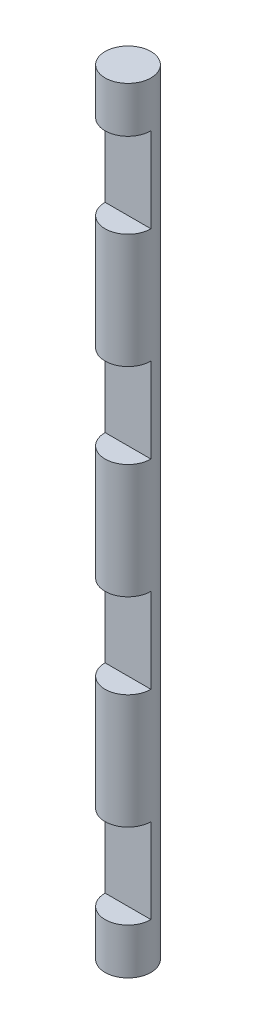
ISO-10303-21;
HEADER;
FILE_DESCRIPTION(('STEP AP214'),'2;1');
FILE_NAME('part.step','',(''),(''),'','','');
FILE_SCHEMA(('AUTOMOTIVE_DESIGN { 1 0 10303 214 1 1 1 1 }'));
ENDSEC;
DATA;
#1=APPLICATION_CONTEXT('core data for automotive mechanical design processes');
#2=APPLICATION_PROTOCOL_DEFINITION('international standard','automotive_design',2000,#1);
#3=PRODUCT_CONTEXT('',#1,'mechanical');
#4=PRODUCT('Part','Part','',(#3));
#5=PRODUCT_RELATED_PRODUCT_CATEGORY('part','',(#4));
#6=PRODUCT_DEFINITION_FORMATION('','',#4);
#7=PRODUCT_DEFINITION_CONTEXT('part definition',#1,'design');
#8=PRODUCT_DEFINITION('design','',#6,#7);
#9=PRODUCT_DEFINITION_SHAPE('','',#8);
#10=(LENGTH_UNIT() NAMED_UNIT(*) SI_UNIT(.MILLI.,.METRE.));
#11=(NAMED_UNIT(*) PLANE_ANGLE_UNIT() SI_UNIT($,.RADIAN.));
#12=(NAMED_UNIT(*) SI_UNIT($,.STERADIAN.) SOLID_ANGLE_UNIT());
#13=UNCERTAINTY_MEASURE_WITH_UNIT(LENGTH_MEASURE(1.E-05),#10,'distance_accuracy_value','');
#14=(GEOMETRIC_REPRESENTATION_CONTEXT(3) GLOBAL_UNCERTAINTY_ASSIGNED_CONTEXT((#13)) GLOBAL_UNIT_ASSIGNED_CONTEXT((#10,
#11,#12)) REPRESENTATION_CONTEXT('',''));
#15=CARTESIAN_POINT('',(0.,0.,0.));
#16=DIRECTION('',(0.,0.,1.));
#17=DIRECTION('',(1.,0.,0.));
#18=AXIS2_PLACEMENT_3D('',#15,#16,#17);
#19=CARTESIAN_POINT('',(0.,33.6284271247462,-11.));
#20=DIRECTION('',(0.,-1.,0.));
#21=DIRECTION('',(0.,0.,-1.));
#22=AXIS2_PLACEMENT_3D('',#19,#20,#21);
#23=CYLINDRICAL_SURFACE('',#22,1.);
#24=DIRECTION('',(0.,-1.,0.));
#25=VECTOR('',#24,1.);
#26=CARTESIAN_POINT('',(-1.,33.6284271247462,-11.));
#27=LINE('',#26,#25);
#28=CARTESIAN_POINT('',(-1.,27.1,-11.));
#29=VERTEX_POINT('',#28);
#30=CARTESIAN_POINT('',(-1.,30.8,-11.));
#31=VERTEX_POINT('',#30);
#32=EDGE_CURVE('E132',#29,#31,#27,.F.);
#33=ORIENTED_EDGE('',*,*,#32,.T.);
#34=CARTESIAN_POINT('',(0.,30.8,-11.));
#35=DIRECTION('',(0.,1.,0.));
#36=DIRECTION('',(0.,0.,1.));
#37=AXIS2_PLACEMENT_3D('',#34,#35,#36);
#38=CIRCLE('',#37,1.);
#39=CARTESIAN_POINT('',(1.,30.8,-11.));
#40=VERTEX_POINT('',#39);
#41=EDGE_CURVE('E120',#31,#40,#38,.T.);
#42=ORIENTED_EDGE('',*,*,#41,.T.);
#43=DIRECTION('',(0.,-1.,0.));
#44=VECTOR('',#43,1.);
#45=CARTESIAN_POINT('',(1.,33.6284271247462,-11.));
#46=LINE('',#45,#44);
#47=CARTESIAN_POINT('',(1.,27.1,-11.));
#48=VERTEX_POINT('',#47);
#49=EDGE_CURVE('E137',#40,#48,#46,.T.);
#50=ORIENTED_EDGE('',*,*,#49,.T.);
#51=CARTESIAN_POINT('',(0.,27.1,-11.));
#52=DIRECTION('',(0.,-1.,0.));
#53=DIRECTION('',(0.,0.,-1.));
#54=AXIS2_PLACEMENT_3D('',#51,#52,#53);
#55=CIRCLE('',#54,1.);
#56=EDGE_CURVE('E11',#48,#29,#55,.T.);
#57=ORIENTED_EDGE('',*,*,#56,.T.);
#58=EDGE_LOOP('',(#33,#42,#50,#57));
#59=FACE_BOUND('',#58,.T.);
#60=DIRECTION('',(0.,-1.,0.));
#61=VECTOR('',#60,1.);
#62=CARTESIAN_POINT('',(1.,33.6284271247462,-11.));
#63=LINE('',#62,#61);
#64=CARTESIAN_POINT('',(1.,22.1,-11.));
#65=VERTEX_POINT('',#64);
#66=CARTESIAN_POINT('',(1.,18.4,-11.));
#67=VERTEX_POINT('',#66);
#68=EDGE_CURVE('E167',#65,#67,#63,.T.);
#69=ORIENTED_EDGE('',*,*,#68,.T.);
#70=CARTESIAN_POINT('',(0.,18.4,-11.));
#71=DIRECTION('',(0.,-1.,0.));
#72=DIRECTION('',(0.,0.,-1.));
#73=AXIS2_PLACEMENT_3D('',#70,#71,#72);
#74=CIRCLE('',#73,1.);
#75=CARTESIAN_POINT('',(-1.,18.4,-11.));
#76=VERTEX_POINT('',#75);
#77=EDGE_CURVE('E41',#67,#76,#74,.T.);
#78=ORIENTED_EDGE('',*,*,#77,.T.);
#79=DIRECTION('',(0.,-1.,0.));
#80=VECTOR('',#79,1.);
#81=CARTESIAN_POINT('',(-1.,33.6284271247462,-11.));
#82=LINE('',#81,#80);
#83=CARTESIAN_POINT('',(-1.,22.1,-11.));
#84=VERTEX_POINT('',#83);
#85=EDGE_CURVE('E164',#76,#84,#82,.F.);
#86=ORIENTED_EDGE('',*,*,#85,.T.);
#87=CARTESIAN_POINT('',(0.,22.1,-11.));
#88=DIRECTION('',(0.,-1.,0.));
#89=DIRECTION('',(0.,0.,-1.));
#90=AXIS2_PLACEMENT_3D('',#87,#88,#89);
#91=CIRCLE('',#90,1.);
#92=EDGE_CURVE('E162',#65,#84,#91,.T.);
#93=ORIENTED_EDGE('',*,*,#92,.F.);
#94=EDGE_LOOP('',(#69,#78,#86,#93));
#95=FACE_BOUND('',#94,.T.);
#96=DIRECTION('',(0.,-1.,0.));
#97=VECTOR('',#96,1.);
#98=CARTESIAN_POINT('',(1.,33.6284271247462,-11.));
#99=LINE('',#98,#97);
#100=CARTESIAN_POINT('',(1.,13.4,-11.));
#101=VERTEX_POINT('',#100);
#102=CARTESIAN_POINT('',(1.,9.7,-11.));
#103=VERTEX_POINT('',#102);
#104=EDGE_CURVE('E156',#101,#103,#99,.T.);
#105=ORIENTED_EDGE('',*,*,#104,.T.);
#106=CARTESIAN_POINT('',(0.,9.7,-11.));
#107=DIRECTION('',(0.,-1.,0.));
#108=DIRECTION('',(0.,0.,-1.));
#109=AXIS2_PLACEMENT_3D('',#106,#107,#108);
#110=CIRCLE('',#109,1.);
#111=CARTESIAN_POINT('',(-1.,9.7,-11.));
#112=VERTEX_POINT('',#111);
#113=EDGE_CURVE('E159',#103,#112,#110,.T.);
#114=ORIENTED_EDGE('',*,*,#113,.T.);
#115=DIRECTION('',(0.,-1.,0.));
#116=VECTOR('',#115,1.);
#117=CARTESIAN_POINT('',(-1.,33.6284271247462,-11.));
#118=LINE('',#117,#116);
#119=CARTESIAN_POINT('',(-1.,13.4,-11.));
#120=VERTEX_POINT('',#119);
#121=EDGE_CURVE('E153',#112,#120,#118,.F.);
#122=ORIENTED_EDGE('',*,*,#121,.T.);
#123=CARTESIAN_POINT('',(0.,13.4,-11.));
#124=DIRECTION('',(0.,-1.,0.));
#125=DIRECTION('',(0.,0.,-1.));
#126=AXIS2_PLACEMENT_3D('',#123,#124,#125);
#127=CIRCLE('',#126,1.);
#128=EDGE_CURVE('E151',#101,#120,#127,.T.);
#129=ORIENTED_EDGE('',*,*,#128,.F.);
#130=EDGE_LOOP('',(#105,#114,#122,#129));
#131=FACE_BOUND('',#130,.T.);
#132=CARTESIAN_POINT('',(0.,4.7,-11.));
#133=DIRECTION('',(0.,-1.,0.));
#134=DIRECTION('',(0.,0.,-1.));
#135=AXIS2_PLACEMENT_3D('',#132,#133,#134);
#136=CIRCLE('',#135,1.);
#137=CARTESIAN_POINT('',(1.,4.7,-11.));
#138=VERTEX_POINT('',#137);
#139=CARTESIAN_POINT('',(-1.,4.7,-11.));
#140=VERTEX_POINT('',#139);
#141=EDGE_CURVE('E109',#138,#140,#136,.T.);
#142=ORIENTED_EDGE('',*,*,#141,.F.);
#143=DIRECTION('',(0.,-1.,0.));
#144=VECTOR('',#143,1.);
#145=CARTESIAN_POINT('',(1.,33.6284271247462,-11.));
#146=LINE('',#145,#144);
#147=CARTESIAN_POINT('',(1.,1.,-11.));
#148=VERTEX_POINT('',#147);
#149=EDGE_CURVE('E108',#138,#148,#146,.T.);
#150=ORIENTED_EDGE('',*,*,#149,.T.);
#151=CARTESIAN_POINT('',(0.,1.,-11.));
#152=DIRECTION('',(0.,-1.,0.));
#153=DIRECTION('',(0.,0.,-1.));
#154=AXIS2_PLACEMENT_3D('',#151,#152,#153);
#155=CIRCLE('',#154,1.00000000000001);
#156=CARTESIAN_POINT('',(-1.00000000000001,1.,-11.));
#157=VERTEX_POINT('',#156);
#158=EDGE_CURVE('E114',#148,#157,#155,.T.);
#159=ORIENTED_EDGE('',*,*,#158,.T.);
#160=DIRECTION('',(0.,-1.,0.));
#161=VECTOR('',#160,1.);
#162=CARTESIAN_POINT('',(-1.,33.6284271247462,-11.));
#163=LINE('',#162,#161);
#164=EDGE_CURVE('E98',#157,#140,#163,.F.);
#165=ORIENTED_EDGE('',*,*,#164,.T.);
#166=EDGE_LOOP('',(#142,#150,#159,#165));
#167=FACE_BOUND('',#166,.T.);
#168=CARTESIAN_POINT('',(0.,32.8,-11.));
#169=DIRECTION('',(0.,1.,0.));
#170=DIRECTION('',(0.,0.,1.));
#171=AXIS2_PLACEMENT_3D('',#168,#169,#170);
#172=CIRCLE('',#171,1.);
#173=CARTESIAN_POINT('',(0.,32.8,-10.));
#174=VERTEX_POINT('',#173);
#175=EDGE_CURVE('E123',#174,#174,#172,.T.);
#176=ORIENTED_EDGE('',*,*,#175,.F.);
#177=EDGE_LOOP('',(#176));
#178=FACE_BOUND('',#177,.T.);
#179=CARTESIAN_POINT('',(0.,-1.,-11.));
#180=DIRECTION('',(0.,-1.,0.));
#181=DIRECTION('',(0.,0.,-1.));
#182=AXIS2_PLACEMENT_3D('',#179,#180,#181);
#183=CIRCLE('',#182,1.00000000000001);
#184=CARTESIAN_POINT('',(0.,-1.,-12.));
#185=VERTEX_POINT('',#184);
#186=EDGE_CURVE('E117',#185,#185,#183,.T.);
#187=ORIENTED_EDGE('',*,*,#186,.F.);
#188=EDGE_LOOP('',(#187));
#189=FACE_BOUND('',#188,.T.);
#190=ADVANCED_FACE('F34',(#59,#95,#131,#167,#178,#189),#23,.T.);
#191=CARTESIAN_POINT('',(-11.,1.,-11.));
#192=DIRECTION('',(0.,0.,-1.));
#193=DIRECTION('',(-1.,0.,0.));
#194=AXIS2_PLACEMENT_3D('',#191,#192,#193);
#195=PLANE('',#194);
#196=DIRECTION('',(-1.,0.,0.));
#197=VECTOR('',#196,1.);
#198=CARTESIAN_POINT('',(-11.,4.7,-11.));
#199=LINE('',#198,#197);
#200=EDGE_CURVE('E104',#138,#140,#199,.T.);
#201=ORIENTED_EDGE('',*,*,#200,.T.);
#202=ORIENTED_EDGE('',*,*,#164,.F.);
#203=DIRECTION('',(-1.,0.,0.));
#204=VECTOR('',#203,1.);
#205=CARTESIAN_POINT('',(-11.,1.,-11.));
#206=LINE('',#205,#204);
#207=EDGE_CURVE('E102',#148,#157,#206,.T.);
#208=ORIENTED_EDGE('',*,*,#207,.F.);
#209=ORIENTED_EDGE('',*,*,#149,.F.);
#210=EDGE_LOOP('',(#201,#202,#208,#209));
#211=FACE_BOUND('',#210,.T.);
#212=ADVANCED_FACE('F100',(#211),#195,.F.);
#213=CARTESIAN_POINT('',(0.,4.7,0.));
#214=DIRECTION('',(0.,-1.,0.));
#215=DIRECTION('',(0.,0.,-1.));
#216=AXIS2_PLACEMENT_3D('',#213,#214,#215);
#217=PLANE('',#216);
#218=ORIENTED_EDGE('',*,*,#141,.T.);
#219=ORIENTED_EDGE('',*,*,#200,.F.);
#220=EDGE_LOOP('',(#218,#219));
#221=FACE_BOUND('',#220,.T.);
#222=ADVANCED_FACE('F196',(#221),#217,.T.);
#223=CARTESIAN_POINT('',(-11.,9.7,-11.));
#224=DIRECTION('',(0.,0.,-1.));
#225=DIRECTION('',(-1.,0.,0.));
#226=AXIS2_PLACEMENT_3D('',#223,#224,#225);
#227=PLANE('',#226);
#228=DIRECTION('',(-1.,0.,0.));
#229=VECTOR('',#228,1.);
#230=CARTESIAN_POINT('',(-11.,13.4,-11.));
#231=LINE('',#230,#229);
#232=EDGE_CURVE('E54',#101,#120,#231,.T.);
#233=ORIENTED_EDGE('',*,*,#232,.T.);
#234=ORIENTED_EDGE('',*,*,#121,.F.);
#235=DIRECTION('',(-1.,0.,0.));
#236=VECTOR('',#235,1.);
#237=CARTESIAN_POINT('',(-11.,9.7,-11.));
#238=LINE('',#237,#236);
#239=EDGE_CURVE('E144',#103,#112,#238,.T.);
#240=ORIENTED_EDGE('',*,*,#239,.F.);
#241=ORIENTED_EDGE('',*,*,#104,.F.);
#242=EDGE_LOOP('',(#233,#234,#240,#241));
#243=FACE_BOUND('',#242,.T.);
#244=ADVANCED_FACE('F267',(#243),#227,.F.);
#245=CARTESIAN_POINT('',(0.,9.7,0.));
#246=DIRECTION('',(0.,-1.,0.));
#247=DIRECTION('',(0.,0.,-1.));
#248=AXIS2_PLACEMENT_3D('',#245,#246,#247);
#249=PLANE('',#248);
#250=ORIENTED_EDGE('',*,*,#239,.T.);
#251=ORIENTED_EDGE('',*,*,#113,.F.);
#252=EDGE_LOOP('',(#250,#251));
#253=FACE_BOUND('',#252,.T.);
#254=ADVANCED_FACE('F274',(#253),#249,.F.);
#255=CARTESIAN_POINT('',(0.,13.4,0.));
#256=DIRECTION('',(0.,-1.,0.));
#257=DIRECTION('',(0.,0.,-1.));
#258=AXIS2_PLACEMENT_3D('',#255,#256,#257);
#259=PLANE('',#258);
#260=ORIENTED_EDGE('',*,*,#128,.T.);
#261=ORIENTED_EDGE('',*,*,#232,.F.);
#262=EDGE_LOOP('',(#260,#261));
#263=FACE_BOUND('',#262,.T.);
#264=ADVANCED_FACE('F282',(#263),#259,.T.);
#265=CARTESIAN_POINT('',(-11.,18.4,-11.));
#266=DIRECTION('',(0.,0.,-1.));
#267=DIRECTION('',(-1.,0.,0.));
#268=AXIS2_PLACEMENT_3D('',#265,#266,#267);
#269=PLANE('',#268);
#270=DIRECTION('',(-1.,0.,0.));
#271=VECTOR('',#270,1.);
#272=CARTESIAN_POINT('',(-11.,22.1,-11.));
#273=LINE('',#272,#271);
#274=EDGE_CURVE('E47',#65,#84,#273,.T.);
#275=ORIENTED_EDGE('',*,*,#274,.T.);
#276=ORIENTED_EDGE('',*,*,#85,.F.);
#277=DIRECTION('',(-1.,0.,0.));
#278=VECTOR('',#277,1.);
#279=CARTESIAN_POINT('',(-11.,18.4,-11.));
#280=LINE('',#279,#278);
#281=EDGE_CURVE('E140',#67,#76,#280,.T.);
#282=ORIENTED_EDGE('',*,*,#281,.F.);
#283=ORIENTED_EDGE('',*,*,#68,.F.);
#284=EDGE_LOOP('',(#275,#276,#282,#283));
#285=FACE_BOUND('',#284,.T.);
#286=ADVANCED_FACE('F177',(#285),#269,.F.);
#287=CARTESIAN_POINT('',(0.,18.4,0.));
#288=DIRECTION('',(0.,-1.,0.));
#289=DIRECTION('',(0.,0.,-1.));
#290=AXIS2_PLACEMENT_3D('',#287,#288,#289);
#291=PLANE('',#290);
#292=ORIENTED_EDGE('',*,*,#281,.T.);
#293=ORIENTED_EDGE('',*,*,#77,.F.);
#294=EDGE_LOOP('',(#292,#293));
#295=FACE_BOUND('',#294,.T.);
#296=ADVANCED_FACE('F175',(#295),#291,.F.);
#297=CARTESIAN_POINT('',(0.,22.1,0.));
#298=DIRECTION('',(0.,-1.,0.));
#299=DIRECTION('',(0.,0.,-1.));
#300=AXIS2_PLACEMENT_3D('',#297,#298,#299);
#301=PLANE('',#300);
#302=ORIENTED_EDGE('',*,*,#92,.T.);
#303=ORIENTED_EDGE('',*,*,#274,.F.);
#304=EDGE_LOOP('',(#302,#303));
#305=FACE_BOUND('',#304,.T.);
#306=ADVANCED_FACE('F178',(#305),#301,.T.);
#307=CARTESIAN_POINT('',(0.,27.1,0.));
#308=DIRECTION('',(0.,-1.,0.));
#309=DIRECTION('',(0.,0.,-1.));
#310=AXIS2_PLACEMENT_3D('',#307,#308,#309);
#311=PLANE('',#310);
#312=DIRECTION('',(-1.,0.,0.));
#313=VECTOR('',#312,1.);
#314=CARTESIAN_POINT('',(-11.,27.1,-11.));
#315=LINE('',#314,#313);
#316=EDGE_CURVE('E129',#48,#29,#315,.T.);
#317=ORIENTED_EDGE('',*,*,#316,.T.);
#318=ORIENTED_EDGE('',*,*,#56,.F.);
#319=EDGE_LOOP('',(#317,#318));
#320=FACE_BOUND('',#319,.T.);
#321=ADVANCED_FACE('F180',(#320),#311,.F.);
#322=CARTESIAN_POINT('',(-11.,27.1,-11.));
#323=DIRECTION('',(0.,0.,-1.));
#324=DIRECTION('',(-1.,0.,0.));
#325=AXIS2_PLACEMENT_3D('',#322,#323,#324);
#326=PLANE('',#325);
#327=DIRECTION('',(-1.,0.,0.));
#328=VECTOR('',#327,1.);
#329=CARTESIAN_POINT('',(-11.,30.8,-11.));
#330=LINE('',#329,#328);
#331=EDGE_CURVE('E126',#40,#31,#330,.T.);
#332=ORIENTED_EDGE('',*,*,#331,.T.);
#333=ORIENTED_EDGE('',*,*,#32,.F.);
#334=ORIENTED_EDGE('',*,*,#316,.F.);
#335=ORIENTED_EDGE('',*,*,#49,.F.);
#336=EDGE_LOOP('',(#332,#333,#334,#335));
#337=FACE_BOUND('',#336,.T.);
#338=ADVANCED_FACE('F186',(#337),#326,.F.);
#339=CARTESIAN_POINT('',(0.,32.8,0.));
#340=DIRECTION('',(0.,1.,0.));
#341=DIRECTION('',(0.,0.,1.));
#342=AXIS2_PLACEMENT_3D('',#339,#340,#341);
#343=PLANE('',#342);
#344=ORIENTED_EDGE('',*,*,#175,.T.);
#345=EDGE_LOOP('',(#344));
#346=FACE_BOUND('',#345,.T.);
#347=ADVANCED_FACE('F203',(#346),#343,.T.);
#348=CARTESIAN_POINT('',(0.,30.8,0.));
#349=DIRECTION('',(0.,1.,0.));
#350=DIRECTION('',(0.,0.,1.));
#351=AXIS2_PLACEMENT_3D('',#348,#349,#350);
#352=PLANE('',#351);
#353=ORIENTED_EDGE('',*,*,#331,.F.);
#354=ORIENTED_EDGE('',*,*,#41,.F.);
#355=EDGE_LOOP('',(#353,#354));
#356=FACE_BOUND('',#355,.T.);
#357=ADVANCED_FACE('F201',(#356),#352,.F.);
#358=CARTESIAN_POINT('',(0.,1.,-11.));
#359=DIRECTION('',(0.,-1.,0.));
#360=DIRECTION('',(0.,0.,-1.));
#361=AXIS2_PLACEMENT_3D('',#358,#359,#360);
#362=PLANE('',#361);
#363=ORIENTED_EDGE('',*,*,#158,.F.);
#364=ORIENTED_EDGE('',*,*,#207,.T.);
#365=EDGE_LOOP('',(#363,#364));
#366=FACE_BOUND('',#365,.T.);
#367=ADVANCED_FACE('F113',(#366),#362,.F.);
#368=CARTESIAN_POINT('',(0.,-1.,-11.));
#369=DIRECTION('',(0.,-1.,0.));
#370=DIRECTION('',(0.,0.,-1.));
#371=AXIS2_PLACEMENT_3D('',#368,#369,#370);
#372=PLANE('',#371);
#373=ORIENTED_EDGE('',*,*,#186,.T.);
#374=EDGE_LOOP('',(#373));
#375=FACE_BOUND('',#374,.T.);
#376=ADVANCED_FACE('F209',(#375),#372,.T.);
#377=CLOSED_SHELL('',(#190,#212,#222,#244,#254,#264,#286,#296,#306,#321,#338,#347,#357,#367,#376));
#378=MANIFOLD_SOLID_BREP('B2',#377);
#379=ADVANCED_BREP_SHAPE_REPRESENTATION('',(#18,#378),#14);
#380=SHAPE_DEFINITION_REPRESENTATION(#9,#379);
ENDSEC;
END-ISO-10303-21;
